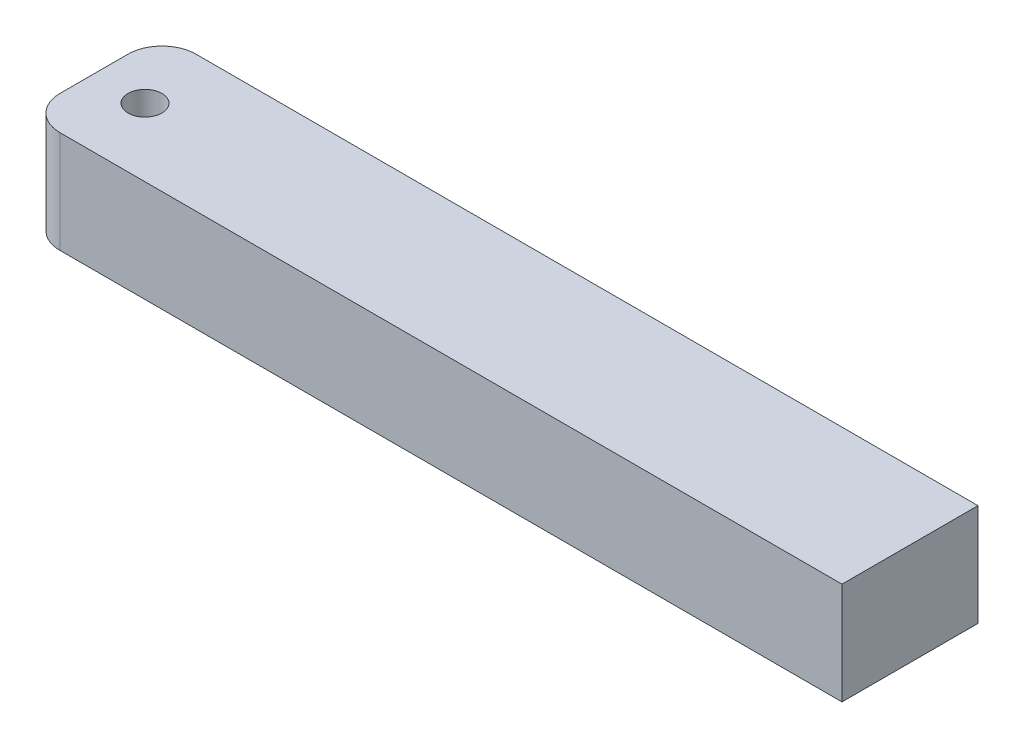
ISO-10303-21;
HEADER;
FILE_DESCRIPTION(('STEP AP214'),'2;1');
FILE_NAME('part.step','',(''),(''),'','','');
FILE_SCHEMA(('AUTOMOTIVE_DESIGN { 1 0 10303 214 1 1 1 1 }'));
ENDSEC;
DATA;
#1=APPLICATION_CONTEXT('core data for automotive mechanical design processes');
#2=APPLICATION_PROTOCOL_DEFINITION('international standard','automotive_design',2000,#1);
#3=PRODUCT_CONTEXT('',#1,'mechanical');
#4=PRODUCT('Part','Part','',(#3));
#5=PRODUCT_RELATED_PRODUCT_CATEGORY('part','',(#4));
#6=PRODUCT_DEFINITION_FORMATION('','',#4);
#7=PRODUCT_DEFINITION_CONTEXT('part definition',#1,'design');
#8=PRODUCT_DEFINITION('design','',#6,#7);
#9=PRODUCT_DEFINITION_SHAPE('','',#8);
#10=(LENGTH_UNIT() NAMED_UNIT(*) SI_UNIT(.MILLI.,.METRE.));
#11=(NAMED_UNIT(*) PLANE_ANGLE_UNIT() SI_UNIT($,.RADIAN.));
#12=(NAMED_UNIT(*) SI_UNIT($,.STERADIAN.) SOLID_ANGLE_UNIT());
#13=UNCERTAINTY_MEASURE_WITH_UNIT(LENGTH_MEASURE(1.E-05),#10,'distance_accuracy_value','');
#14=(GEOMETRIC_REPRESENTATION_CONTEXT(3) GLOBAL_UNCERTAINTY_ASSIGNED_CONTEXT((#13)) GLOBAL_UNIT_ASSIGNED_CONTEXT((#10,
#11,#12)) REPRESENTATION_CONTEXT('',''));
#15=CARTESIAN_POINT('',(0.,0.,0.));
#16=DIRECTION('',(0.,0.,1.));
#17=DIRECTION('',(1.,0.,0.));
#18=AXIS2_PLACEMENT_3D('',#15,#16,#17);
#19=CARTESIAN_POINT('',(-292.1,38.1,-38.1));
#20=DIRECTION('',(0.,-1.,0.));
#21=DIRECTION('',(0.,0.,-1.));
#22=AXIS2_PLACEMENT_3D('',#19,#20,#21);
#23=PLANE('',#22);
#24=DIRECTION('',(0.,0.,-1.));
#25=VECTOR('',#24,1.);
#26=CARTESIAN_POINT('',(0.,38.1,0.));
#27=LINE('',#26,#25);
#28=CARTESIAN_POINT('',(0.,38.1,0.));
#29=VERTEX_POINT('',#28);
#30=CARTESIAN_POINT('',(0.,38.1,-50.8));
#31=VERTEX_POINT('',#30);
#32=EDGE_CURVE('E146',#29,#31,#27,.T.);
#33=ORIENTED_EDGE('',*,*,#32,.T.);
#34=DIRECTION('',(-1.,0.,0.));
#35=VECTOR('',#34,1.);
#36=CARTESIAN_POINT('',(0.,38.1,-50.8));
#37=LINE('',#36,#35);
#38=CARTESIAN_POINT('',(-292.1,38.1,-50.8));
#39=VERTEX_POINT('',#38);
#40=EDGE_CURVE('E94',#31,#39,#37,.T.);
#41=ORIENTED_EDGE('',*,*,#40,.T.);
#42=CARTESIAN_POINT('',(-292.1,38.1,-38.1));
#43=DIRECTION('',(0.,1.,0.));
#44=DIRECTION('',(0.,0.,-1.));
#45=AXIS2_PLACEMENT_3D('',#42,#43,#44);
#46=CIRCLE('',#45,12.7);
#47=CARTESIAN_POINT('',(-304.8,38.1,-38.1));
#48=VERTEX_POINT('',#47);
#49=EDGE_CURVE('E107',#39,#48,#46,.T.);
#50=ORIENTED_EDGE('',*,*,#49,.T.);
#51=DIRECTION('',(0.,0.,1.));
#52=VECTOR('',#51,1.);
#53=CARTESIAN_POINT('',(-304.8,38.1,-12.7));
#54=LINE('',#53,#52);
#55=CARTESIAN_POINT('',(-304.8,38.1,-12.7));
#56=VERTEX_POINT('',#55);
#57=EDGE_CURVE('E101',#48,#56,#54,.T.);
#58=ORIENTED_EDGE('',*,*,#57,.T.);
#59=CARTESIAN_POINT('',(-292.1,38.1,-12.7));
#60=DIRECTION('',(0.,1.,0.));
#61=DIRECTION('',(0.,0.,1.));
#62=AXIS2_PLACEMENT_3D('',#59,#60,#61);
#63=CIRCLE('',#62,12.7);
#64=CARTESIAN_POINT('',(-292.1,38.1,0.));
#65=VERTEX_POINT('',#64);
#66=EDGE_CURVE('E105',#56,#65,#63,.T.);
#67=ORIENTED_EDGE('',*,*,#66,.T.);
#68=DIRECTION('',(1.,0.,0.));
#69=VECTOR('',#68,1.);
#70=CARTESIAN_POINT('',(0.,38.1,0.));
#71=LINE('',#70,#69);
#72=EDGE_CURVE('E57',#65,#29,#71,.T.);
#73=ORIENTED_EDGE('',*,*,#72,.T.);
#74=EDGE_LOOP('',(#33,#41,#50,#58,#67,#73));
#75=FACE_BOUND('',#74,.T.);
#76=CARTESIAN_POINT('',(-285.75,38.1,-25.4));
#77=DIRECTION('',(0.,1.,0.));
#78=DIRECTION('',(0.,0.,1.));
#79=AXIS2_PLACEMENT_3D('',#76,#77,#78);
#80=CIRCLE('',#79,6.35);
#81=CARTESIAN_POINT('',(-285.75,38.1,-31.75));
#82=VERTEX_POINT('',#81);
#83=EDGE_CURVE('E134',#82,#82,#80,.T.);
#84=ORIENTED_EDGE('',*,*,#83,.F.);
#85=EDGE_LOOP('',(#84));
#86=FACE_BOUND('',#85,.T.);
#87=ADVANCED_FACE('F39',(#75,#86),#23,.F.);
#88=CARTESIAN_POINT('',(-292.1,0.,-38.1));
#89=DIRECTION('',(0.,-1.,0.));
#90=DIRECTION('',(0.,0.,-1.));
#91=AXIS2_PLACEMENT_3D('',#88,#89,#90);
#92=PLANE('',#91);
#93=DIRECTION('',(0.,0.,-1.));
#94=VECTOR('',#93,1.);
#95=CARTESIAN_POINT('',(0.,0.,0.));
#96=LINE('',#95,#94);
#97=CARTESIAN_POINT('',(0.,0.,0.));
#98=VERTEX_POINT('',#97);
#99=CARTESIAN_POINT('',(0.,0.,-50.8));
#100=VERTEX_POINT('',#99);
#101=EDGE_CURVE('E129',#98,#100,#96,.T.);
#102=ORIENTED_EDGE('',*,*,#101,.F.);
#103=DIRECTION('',(1.,0.,0.));
#104=VECTOR('',#103,1.);
#105=CARTESIAN_POINT('',(0.,0.,0.));
#106=LINE('',#105,#104);
#107=CARTESIAN_POINT('',(-292.1,0.,0.));
#108=VERTEX_POINT('',#107);
#109=EDGE_CURVE('E86',#108,#98,#106,.T.);
#110=ORIENTED_EDGE('',*,*,#109,.F.);
#111=CARTESIAN_POINT('',(-292.1,0.,-12.7));
#112=DIRECTION('',(0.,1.,0.));
#113=DIRECTION('',(0.,0.,1.));
#114=AXIS2_PLACEMENT_3D('',#111,#112,#113);
#115=CIRCLE('',#114,12.7);
#116=CARTESIAN_POINT('',(-304.8,0.,-12.7));
#117=VERTEX_POINT('',#116);
#118=EDGE_CURVE('E80',#117,#108,#115,.T.);
#119=ORIENTED_EDGE('',*,*,#118,.F.);
#120=DIRECTION('',(0.,0.,1.));
#121=VECTOR('',#120,1.);
#122=CARTESIAN_POINT('',(-304.8,0.,-12.7));
#123=LINE('',#122,#121);
#124=CARTESIAN_POINT('',(-304.8,0.,-38.1));
#125=VERTEX_POINT('',#124);
#126=EDGE_CURVE('E116',#125,#117,#123,.T.);
#127=ORIENTED_EDGE('',*,*,#126,.F.);
#128=CARTESIAN_POINT('',(-292.1,0.,-38.1));
#129=DIRECTION('',(0.,1.,0.));
#130=DIRECTION('',(0.,0.,-1.));
#131=AXIS2_PLACEMENT_3D('',#128,#129,#130);
#132=CIRCLE('',#131,12.7);
#133=CARTESIAN_POINT('',(-292.1,0.,-50.8));
#134=VERTEX_POINT('',#133);
#135=EDGE_CURVE('E137',#134,#125,#132,.T.);
#136=ORIENTED_EDGE('',*,*,#135,.F.);
#137=DIRECTION('',(-1.,0.,0.));
#138=VECTOR('',#137,1.);
#139=CARTESIAN_POINT('',(0.,0.,-50.8));
#140=LINE('',#139,#138);
#141=EDGE_CURVE('E133',#100,#134,#140,.T.);
#142=ORIENTED_EDGE('',*,*,#141,.F.);
#143=EDGE_LOOP('',(#102,#110,#119,#127,#136,#142));
#144=FACE_BOUND('',#143,.T.);
#145=CARTESIAN_POINT('',(-285.75,0.,-25.4));
#146=DIRECTION('',(0.,1.,0.));
#147=DIRECTION('',(0.,0.,1.));
#148=AXIS2_PLACEMENT_3D('',#145,#146,#147);
#149=CIRCLE('',#148,6.35);
#150=CARTESIAN_POINT('',(-285.75,0.,-31.75));
#151=VERTEX_POINT('',#150);
#152=EDGE_CURVE('E243',#151,#151,#149,.T.);
#153=ORIENTED_EDGE('',*,*,#152,.T.);
#154=EDGE_LOOP('',(#153));
#155=FACE_BOUND('',#154,.T.);
#156=ADVANCED_FACE('F159',(#144,#155),#92,.T.);
#157=CARTESIAN_POINT('',(0.,38.1,0.));
#158=DIRECTION('',(-1.,0.,0.));
#159=DIRECTION('',(0.,0.,1.));
#160=AXIS2_PLACEMENT_3D('',#157,#158,#159);
#161=PLANE('',#160);
#162=ORIENTED_EDGE('',*,*,#101,.T.);
#163=DIRECTION('',(0.,-1.,0.));
#164=VECTOR('',#163,1.);
#165=CARTESIAN_POINT('',(0.,38.1,-50.8));
#166=LINE('',#165,#164);
#167=EDGE_CURVE('E11',#31,#100,#166,.T.);
#168=ORIENTED_EDGE('',*,*,#167,.F.);
#169=ORIENTED_EDGE('',*,*,#32,.F.);
#170=DIRECTION('',(0.,-1.,0.));
#171=VECTOR('',#170,1.);
#172=CARTESIAN_POINT('',(0.,38.1,0.));
#173=LINE('',#172,#171);
#174=EDGE_CURVE('E125',#29,#98,#173,.T.);
#175=ORIENTED_EDGE('',*,*,#174,.T.);
#176=EDGE_LOOP('',(#162,#168,#169,#175));
#177=FACE_BOUND('',#176,.T.);
#178=ADVANCED_FACE('F41',(#177),#161,.F.);
#179=CARTESIAN_POINT('',(0.,38.1,-50.8));
#180=DIRECTION('',(0.,0.,1.));
#181=DIRECTION('',(1.,0.,0.));
#182=AXIS2_PLACEMENT_3D('',#179,#180,#181);
#183=PLANE('',#182);
#184=ORIENTED_EDGE('',*,*,#141,.T.);
#185=DIRECTION('',(0.,-1.,0.));
#186=VECTOR('',#185,1.);
#187=CARTESIAN_POINT('',(-292.1,38.1,-50.8));
#188=LINE('',#187,#186);
#189=EDGE_CURVE('E49',#39,#134,#188,.T.);
#190=ORIENTED_EDGE('',*,*,#189,.F.);
#191=ORIENTED_EDGE('',*,*,#40,.F.);
#192=ORIENTED_EDGE('',*,*,#167,.T.);
#193=EDGE_LOOP('',(#184,#190,#191,#192));
#194=FACE_BOUND('',#193,.T.);
#195=ADVANCED_FACE('F184',(#194),#183,.F.);
#196=CARTESIAN_POINT('',(-292.1,38.1,-38.1));
#197=DIRECTION('',(0.,-1.,0.));
#198=DIRECTION('',(0.,0.,-1.));
#199=AXIS2_PLACEMENT_3D('',#196,#197,#198);
#200=CYLINDRICAL_SURFACE('',#199,12.7);
#201=ORIENTED_EDGE('',*,*,#135,.T.);
#202=DIRECTION('',(0.,-1.,0.));
#203=VECTOR('',#202,1.);
#204=CARTESIAN_POINT('',(-304.8,38.1,-38.1));
#205=LINE('',#204,#203);
#206=EDGE_CURVE('E118',#48,#125,#205,.T.);
#207=ORIENTED_EDGE('',*,*,#206,.F.);
#208=ORIENTED_EDGE('',*,*,#49,.F.);
#209=ORIENTED_EDGE('',*,*,#189,.T.);
#210=EDGE_LOOP('',(#201,#207,#208,#209));
#211=FACE_BOUND('',#210,.T.);
#212=ADVANCED_FACE('F156',(#211),#200,.T.);
#213=CARTESIAN_POINT('',(-304.8,38.1,-12.7));
#214=DIRECTION('',(1.,0.,0.));
#215=DIRECTION('',(0.,0.,-1.));
#216=AXIS2_PLACEMENT_3D('',#213,#214,#215);
#217=PLANE('',#216);
#218=ORIENTED_EDGE('',*,*,#126,.T.);
#219=DIRECTION('',(0.,-1.,0.));
#220=VECTOR('',#219,1.);
#221=CARTESIAN_POINT('',(-304.8,38.1,-12.7));
#222=LINE('',#221,#220);
#223=EDGE_CURVE('E113',#56,#117,#222,.T.);
#224=ORIENTED_EDGE('',*,*,#223,.F.);
#225=ORIENTED_EDGE('',*,*,#57,.F.);
#226=ORIENTED_EDGE('',*,*,#206,.T.);
#227=EDGE_LOOP('',(#218,#224,#225,#226));
#228=FACE_BOUND('',#227,.T.);
#229=ADVANCED_FACE('F114',(#228),#217,.F.);
#230=CARTESIAN_POINT('',(-292.1,38.1,-12.7));
#231=DIRECTION('',(0.,-1.,0.));
#232=DIRECTION('',(0.,0.,-1.));
#233=AXIS2_PLACEMENT_3D('',#230,#231,#232);
#234=CYLINDRICAL_SURFACE('',#233,12.7);
#235=ORIENTED_EDGE('',*,*,#118,.T.);
#236=DIRECTION('',(0.,-1.,0.));
#237=VECTOR('',#236,1.);
#238=CARTESIAN_POINT('',(-292.1,38.1,0.));
#239=LINE('',#238,#237);
#240=EDGE_CURVE('E119',#65,#108,#239,.T.);
#241=ORIENTED_EDGE('',*,*,#240,.F.);
#242=ORIENTED_EDGE('',*,*,#66,.F.);
#243=ORIENTED_EDGE('',*,*,#223,.T.);
#244=EDGE_LOOP('',(#235,#241,#242,#243));
#245=FACE_BOUND('',#244,.T.);
#246=ADVANCED_FACE('F121',(#245),#234,.T.);
#247=CARTESIAN_POINT('',(0.,38.1,0.));
#248=DIRECTION('',(0.,0.,-1.));
#249=DIRECTION('',(-1.,0.,0.));
#250=AXIS2_PLACEMENT_3D('',#247,#248,#249);
#251=PLANE('',#250);
#252=ORIENTED_EDGE('',*,*,#109,.T.);
#253=ORIENTED_EDGE('',*,*,#174,.F.);
#254=ORIENTED_EDGE('',*,*,#72,.F.);
#255=ORIENTED_EDGE('',*,*,#240,.T.);
#256=EDGE_LOOP('',(#252,#253,#254,#255));
#257=FACE_BOUND('',#256,.T.);
#258=ADVANCED_FACE('F164',(#257),#251,.F.);
#259=CARTESIAN_POINT('',(-285.75,38.1,-25.4));
#260=DIRECTION('',(0.,-1.,0.));
#261=DIRECTION('',(0.,0.,-1.));
#262=AXIS2_PLACEMENT_3D('',#259,#260,#261);
#263=CYLINDRICAL_SURFACE('',#262,6.35);
#264=CARTESIAN_POINT('',(-285.75,38.1,-31.75));
#265=CARTESIAN_POINT('',(-285.75,37.703125,-31.75));
#266=CARTESIAN_POINT('',(-285.75,37.30625,-31.75));
#267=CARTESIAN_POINT('',(-285.75,36.5125,-31.75));
#268=CARTESIAN_POINT('',(-285.75,36.115625,-31.75));
#269=CARTESIAN_POINT('',(-285.75,35.321875,-31.75));
#270=CARTESIAN_POINT('',(-285.75,34.925,-31.75));
#271=CARTESIAN_POINT('',(-285.75,34.13125,-31.75));
#272=CARTESIAN_POINT('',(-285.75,33.734375,-31.75));
#273=CARTESIAN_POINT('',(-285.75,32.940625,-31.75));
#274=CARTESIAN_POINT('',(-285.75,32.54375,-31.75));
#275=CARTESIAN_POINT('',(-285.75,31.75,-31.75));
#276=CARTESIAN_POINT('',(-285.75,31.353125,-31.75));
#277=CARTESIAN_POINT('',(-285.75,30.559375,-31.75));
#278=CARTESIAN_POINT('',(-285.75,30.1625,-31.75));
#279=CARTESIAN_POINT('',(-285.75,29.36875,-31.75));
#280=CARTESIAN_POINT('',(-285.75,28.971875,-31.75));
#281=CARTESIAN_POINT('',(-285.75,28.178125,-31.75));
#282=CARTESIAN_POINT('',(-285.75,27.78125,-31.75));
#283=CARTESIAN_POINT('',(-285.75,26.9875,-31.75));
#284=CARTESIAN_POINT('',(-285.75,26.590625,-31.75));
#285=CARTESIAN_POINT('',(-285.75,25.796875,-31.75));
#286=CARTESIAN_POINT('',(-285.75,25.4,-31.75));
#287=CARTESIAN_POINT('',(-285.75,24.60625,-31.75));
#288=CARTESIAN_POINT('',(-285.75,24.209375,-31.75));
#289=CARTESIAN_POINT('',(-285.75,23.415625,-31.75));
#290=CARTESIAN_POINT('',(-285.75,23.01875,-31.75));
#291=CARTESIAN_POINT('',(-285.75,22.225,-31.75));
#292=CARTESIAN_POINT('',(-285.75,21.828125,-31.75));
#293=CARTESIAN_POINT('',(-285.75,21.034375,-31.75));
#294=CARTESIAN_POINT('',(-285.75,20.6375,-31.75));
#295=CARTESIAN_POINT('',(-285.75,19.84375,-31.75));
#296=CARTESIAN_POINT('',(-285.75,19.446875,-31.75));
#297=CARTESIAN_POINT('',(-285.75,18.653125,-31.75));
#298=CARTESIAN_POINT('',(-285.75,18.25625,-31.75));
#299=CARTESIAN_POINT('',(-285.75,17.4625,-31.75));
#300=CARTESIAN_POINT('',(-285.75,17.065625,-31.75));
#301=CARTESIAN_POINT('',(-285.75,16.271875,-31.75));
#302=CARTESIAN_POINT('',(-285.75,15.875,-31.75));
#303=CARTESIAN_POINT('',(-285.75,15.08125,-31.75));
#304=CARTESIAN_POINT('',(-285.75,14.684375,-31.75));
#305=CARTESIAN_POINT('',(-285.75,13.890625,-31.75));
#306=CARTESIAN_POINT('',(-285.75,13.49375,-31.75));
#307=CARTESIAN_POINT('',(-285.75,12.7,-31.75));
#308=CARTESIAN_POINT('',(-285.75,12.303125,-31.75));
#309=CARTESIAN_POINT('',(-285.75,11.509375,-31.75));
#310=CARTESIAN_POINT('',(-285.75,11.1125,-31.75));
#311=CARTESIAN_POINT('',(-285.75,10.31875,-31.75));
#312=CARTESIAN_POINT('',(-285.75,9.921875,-31.75));
#313=CARTESIAN_POINT('',(-285.75,9.128125,-31.75));
#314=CARTESIAN_POINT('',(-285.75,8.73125,-31.75));
#315=CARTESIAN_POINT('',(-285.75,7.9375,-31.75));
#316=CARTESIAN_POINT('',(-285.75,7.540625,-31.75));
#317=CARTESIAN_POINT('',(-285.75,6.746875,-31.75));
#318=CARTESIAN_POINT('',(-285.75,6.35,-31.75));
#319=CARTESIAN_POINT('',(-285.75,5.55625,-31.75));
#320=CARTESIAN_POINT('',(-285.75,5.159375,-31.75));
#321=CARTESIAN_POINT('',(-285.75,4.365625,-31.75));
#322=CARTESIAN_POINT('',(-285.75,3.96875,-31.75));
#323=CARTESIAN_POINT('',(-285.75,3.175,-31.75));
#324=CARTESIAN_POINT('',(-285.75,2.778125,-31.75));
#325=CARTESIAN_POINT('',(-285.75,1.984375,-31.75));
#326=CARTESIAN_POINT('',(-285.75,1.5875,-31.75));
#327=CARTESIAN_POINT('',(-285.75,0.79375,-31.75));
#328=CARTESIAN_POINT('',(-285.75,0.396875,-31.75));
#329=CARTESIAN_POINT('',(-285.75,0.,-31.75));
#330=B_SPLINE_CURVE_WITH_KNOTS('',3,(#264,#265,#266,#267,#268,#269,#270,#271,#272,#273,#274,
#275,#276,#277,#278,#279,#280,#281,#282,#283,#284,#285,#286,#287,#288,#289,#290,#291,#292,#293,
#294,#295,#296,#297,#298,#299,#300,#301,#302,#303,#304,#305,#306,#307,#308,#309,#310,#311,#312,
#313,#314,#315,#316,#317,#318,#319,#320,#321,#322,#323,#324,#325,#326,#327,#328,#329),
.UNSPECIFIED.,.F.,.F.,(4,2,2,2,2,2,2,2,2,2,2,2,2,2,2,2,2,2,2,2,2,2,2,2,2,2,2,2,2,2,2,2,4),(0.,
1.19062499999999,2.38124999999999,3.571875,4.7625,5.953125,7.14375,8.33437499999999,9.525,
10.715625,11.90625,13.096875,14.2875,15.478125,16.66875,17.859375,19.05,20.240625,21.43125,
22.621875,23.8125,25.003125,26.19375,27.384375,28.575,29.765625,30.95625,32.146875,33.3375,
34.528125,35.71875,36.909375,38.1),.UNSPECIFIED.);
#331=EDGE_CURVE('BSEAM166',#82,#151,#330,.T.);
#332=ORIENTED_EDGE('',*,*,#83,.T.);
#333=ORIENTED_EDGE('',*,*,#152,.F.);
#334=ORIENTED_EDGE('',*,*,#331,.T.);
#335=ORIENTED_EDGE('',*,*,#331,.F.);
#336=EDGE_LOOP('',(#332,#334,#333,#335));
#337=FACE_BOUND('',#336,.T.);
#338=ADVANCED_FACE('F166',(#337),#263,.F.);
#339=CLOSED_SHELL('',(#87,#156,#178,#195,#212,#229,#246,#258,#338));
#340=MANIFOLD_SOLID_BREP('B2',#339);
#341=ADVANCED_BREP_SHAPE_REPRESENTATION('',(#18,#340),#14);
#342=SHAPE_DEFINITION_REPRESENTATION(#9,#341);
ENDSEC;
END-ISO-10303-21;
